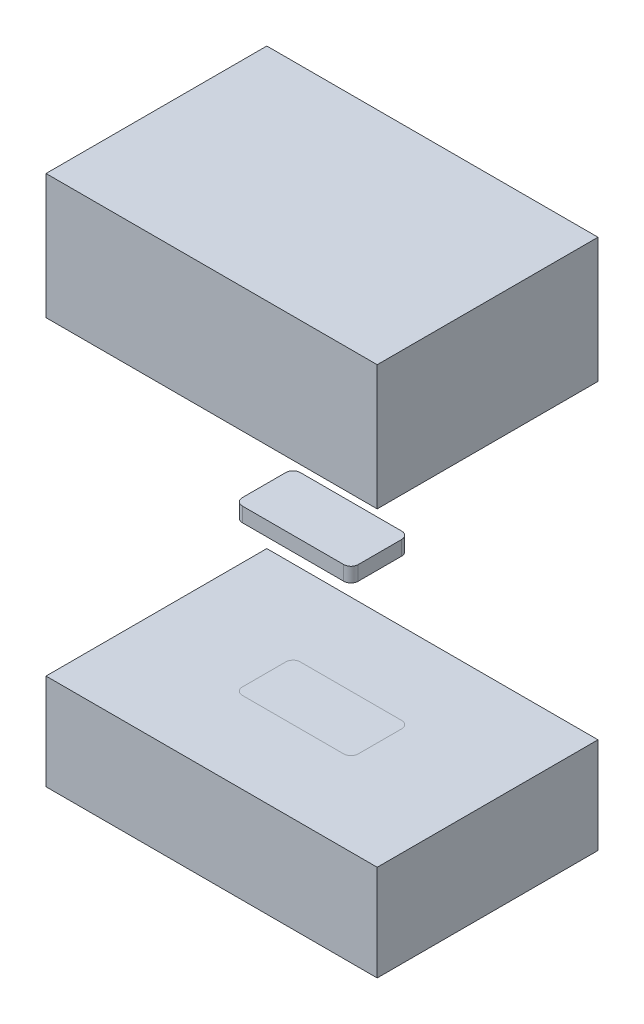
ISO-10303-21;
HEADER;
FILE_DESCRIPTION(('STEP AP214'),'2;1');
FILE_NAME('part.step','',(''),(''),'','','');
FILE_SCHEMA(('AUTOMOTIVE_DESIGN { 1 0 10303 214 1 1 1 1 }'));
ENDSEC;
DATA;
#1=APPLICATION_CONTEXT('core data for automotive mechanical design processes');
#2=APPLICATION_PROTOCOL_DEFINITION('international standard','automotive_design',2000,#1);
#3=PRODUCT_CONTEXT('',#1,'mechanical');
#4=PRODUCT('Part','Part','',(#3));
#5=PRODUCT_RELATED_PRODUCT_CATEGORY('part','',(#4));
#6=PRODUCT_DEFINITION_FORMATION('','',#4);
#7=PRODUCT_DEFINITION_CONTEXT('part definition',#1,'design');
#8=PRODUCT_DEFINITION('design','',#6,#7);
#9=PRODUCT_DEFINITION_SHAPE('','',#8);
#10=(LENGTH_UNIT() NAMED_UNIT(*) SI_UNIT(.MILLI.,.METRE.));
#11=(NAMED_UNIT(*) PLANE_ANGLE_UNIT() SI_UNIT($,.RADIAN.));
#12=(NAMED_UNIT(*) SI_UNIT($,.STERADIAN.) SOLID_ANGLE_UNIT());
#13=UNCERTAINTY_MEASURE_WITH_UNIT(LENGTH_MEASURE(1.E-05),#10,'distance_accuracy_value','');
#14=(GEOMETRIC_REPRESENTATION_CONTEXT(3) GLOBAL_UNCERTAINTY_ASSIGNED_CONTEXT((#13)) GLOBAL_UNIT_ASSIGNED_CONTEXT((#10,
#11,#12)) REPRESENTATION_CONTEXT('',''));
#15=CARTESIAN_POINT('',(0.,0.,0.));
#16=DIRECTION('',(0.,0.,1.));
#17=DIRECTION('',(1.,0.,0.));
#18=AXIS2_PLACEMENT_3D('',#15,#16,#17);
#19=CARTESIAN_POINT('',(0.,-116.265936917931,0.));
#20=DIRECTION('',(0.,-1.,0.));
#21=DIRECTION('',(0.,0.,-1.));
#22=AXIS2_PLACEMENT_3D('',#19,#20,#21);
#23=PLANE('',#22);
#24=DIRECTION('',(0.,0.,-1.));
#25=VECTOR('',#24,1.);
#26=CARTESIAN_POINT('',(76.2,-116.265936917931,50.8));
#27=LINE('',#26,#25);
#28=CARTESIAN_POINT('',(76.2,-116.265936917931,50.8));
#29=VERTEX_POINT('',#28);
#30=CARTESIAN_POINT('',(76.2,-116.265936917931,-50.8));
#31=VERTEX_POINT('',#30);
#32=EDGE_CURVE('E773',#29,#31,#27,.T.);
#33=ORIENTED_EDGE('',*,*,#32,.F.);
#34=DIRECTION('',(1.,0.,0.));
#35=VECTOR('',#34,1.);
#36=CARTESIAN_POINT('',(-76.2,-116.265936917931,50.8));
#37=LINE('',#36,#35);
#38=CARTESIAN_POINT('',(-76.2,-116.265936917931,50.8));
#39=VERTEX_POINT('',#38);
#40=EDGE_CURVE('E782',#39,#29,#37,.T.);
#41=ORIENTED_EDGE('',*,*,#40,.F.);
#42=DIRECTION('',(0.,0.,1.));
#43=VECTOR('',#42,1.);
#44=CARTESIAN_POINT('',(-76.2,-116.265936917931,50.8));
#45=LINE('',#44,#43);
#46=CARTESIAN_POINT('',(-76.2,-116.265936917931,-50.8));
#47=VERTEX_POINT('',#46);
#48=EDGE_CURVE('E779',#47,#39,#45,.T.);
#49=ORIENTED_EDGE('',*,*,#48,.F.);
#50=DIRECTION('',(-1.,0.,0.));
#51=VECTOR('',#50,1.);
#52=CARTESIAN_POINT('',(-76.2,-116.265936917931,-50.8));
#53=LINE('',#52,#51);
#54=EDGE_CURVE('E776',#31,#47,#53,.T.);
#55=ORIENTED_EDGE('',*,*,#54,.F.);
#56=EDGE_LOOP('',(#33,#41,#49,#55));
#57=FACE_BOUND('',#56,.T.);
#58=ADVANCED_FACE('F674',(#57),#23,.T.);
#59=CARTESIAN_POINT('',(-76.2,-116.265936917931,-50.8));
#60=DIRECTION('',(0.,0.,-1.));
#61=DIRECTION('',(-1.,0.,0.));
#62=AXIS2_PLACEMENT_3D('',#59,#60,#61);
#63=PLANE('',#62);
#64=DIRECTION('',(0.,1.,0.));
#65=VECTOR('',#64,1.);
#66=CARTESIAN_POINT('',(-76.2,-116.265936917931,-50.8));
#67=LINE('',#66,#65);
#68=CARTESIAN_POINT('',(-76.2,-72.1334369179305,-50.8));
#69=VERTEX_POINT('',#68);
#70=EDGE_CURVE('E792',#47,#69,#67,.T.);
#71=ORIENTED_EDGE('',*,*,#70,.T.);
#72=DIRECTION('',(1.,0.,0.));
#73=VECTOR('',#72,1.);
#74=CARTESIAN_POINT('',(-76.2,-72.1334369179305,-50.8));
#75=LINE('',#74,#73);
#76=CARTESIAN_POINT('',(76.2,-72.1334369179305,-50.8));
#77=VERTEX_POINT('',#76);
#78=EDGE_CURVE('E678',#69,#77,#75,.T.);
#79=ORIENTED_EDGE('',*,*,#78,.T.);
#80=DIRECTION('',(0.,1.,0.));
#81=VECTOR('',#80,1.);
#82=CARTESIAN_POINT('',(76.2,-116.265936917931,-50.8));
#83=LINE('',#82,#81);
#84=EDGE_CURVE('E785',#31,#77,#83,.T.);
#85=ORIENTED_EDGE('',*,*,#84,.F.);
#86=ORIENTED_EDGE('',*,*,#54,.T.);
#87=EDGE_LOOP('',(#71,#79,#85,#86));
#88=FACE_BOUND('',#87,.T.);
#89=ADVANCED_FACE('F809',(#88),#63,.T.);
#90=CARTESIAN_POINT('',(-76.2,-116.265936917931,50.8));
#91=DIRECTION('',(-1.,0.,0.));
#92=DIRECTION('',(0.,0.,1.));
#93=AXIS2_PLACEMENT_3D('',#90,#91,#92);
#94=PLANE('',#93);
#95=DIRECTION('',(0.,1.,0.));
#96=VECTOR('',#95,1.);
#97=CARTESIAN_POINT('',(-76.2,-116.265936917931,50.8));
#98=LINE('',#97,#96);
#99=CARTESIAN_POINT('',(-76.2,-72.1334369179305,50.8));
#100=VERTEX_POINT('',#99);
#101=EDGE_CURVE('E789',#39,#100,#98,.T.);
#102=ORIENTED_EDGE('',*,*,#101,.T.);
#103=DIRECTION('',(0.,0.,-1.));
#104=VECTOR('',#103,1.);
#105=CARTESIAN_POINT('',(-76.2,-72.1334369179305,50.8));
#106=LINE('',#105,#104);
#107=EDGE_CURVE('E759',#100,#69,#106,.T.);
#108=ORIENTED_EDGE('',*,*,#107,.T.);
#109=ORIENTED_EDGE('',*,*,#70,.F.);
#110=ORIENTED_EDGE('',*,*,#48,.T.);
#111=EDGE_LOOP('',(#102,#108,#109,#110));
#112=FACE_BOUND('',#111,.T.);
#113=ADVANCED_FACE('F816',(#112),#94,.T.);
#114=CARTESIAN_POINT('',(-76.2,-116.265936917931,50.8));
#115=DIRECTION('',(0.,0.,1.));
#116=DIRECTION('',(1.,0.,0.));
#117=AXIS2_PLACEMENT_3D('',#114,#115,#116);
#118=PLANE('',#117);
#119=DIRECTION('',(0.,1.,0.));
#120=VECTOR('',#119,1.);
#121=CARTESIAN_POINT('',(76.2,-116.265936917931,50.8));
#122=LINE('',#121,#120);
#123=CARTESIAN_POINT('',(76.2,-72.1334369179305,50.8));
#124=VERTEX_POINT('',#123);
#125=EDGE_CURVE('E786',#29,#124,#122,.T.);
#126=ORIENTED_EDGE('',*,*,#125,.T.);
#127=DIRECTION('',(-1.,0.,0.));
#128=VECTOR('',#127,1.);
#129=CARTESIAN_POINT('',(-76.2,-72.1334369179305,50.8));
#130=LINE('',#129,#128);
#131=EDGE_CURVE('E767',#124,#100,#130,.T.);
#132=ORIENTED_EDGE('',*,*,#131,.T.);
#133=ORIENTED_EDGE('',*,*,#101,.F.);
#134=ORIENTED_EDGE('',*,*,#40,.T.);
#135=EDGE_LOOP('',(#126,#132,#133,#134));
#136=FACE_BOUND('',#135,.T.);
#137=ADVANCED_FACE('F824',(#136),#118,.T.);
#138=CARTESIAN_POINT('',(76.2,-116.265936917931,50.8));
#139=DIRECTION('',(1.,0.,0.));
#140=DIRECTION('',(0.,0.,-1.));
#141=AXIS2_PLACEMENT_3D('',#138,#139,#140);
#142=PLANE('',#141);
#143=ORIENTED_EDGE('',*,*,#84,.T.);
#144=DIRECTION('',(0.,0.,1.));
#145=VECTOR('',#144,1.);
#146=CARTESIAN_POINT('',(76.2,-72.1334369179305,50.8));
#147=LINE('',#146,#145);
#148=EDGE_CURVE('E770',#77,#124,#147,.T.);
#149=ORIENTED_EDGE('',*,*,#148,.T.);
#150=ORIENTED_EDGE('',*,*,#125,.F.);
#151=ORIENTED_EDGE('',*,*,#32,.T.);
#152=EDGE_LOOP('',(#143,#149,#150,#151));
#153=FACE_BOUND('',#152,.T.);
#154=ADVANCED_FACE('F676',(#153),#142,.T.);
#155=CARTESIAN_POINT('',(0.,-72.1334369179305,0.));
#156=DIRECTION('',(0.,-1.,0.));
#157=DIRECTION('',(0.,0.,-1.));
#158=AXIS2_PLACEMENT_3D('',#155,#156,#157);
#159=PLANE('',#158);
#160=DIRECTION('',(0.,0.,1.));
#161=VECTOR('',#160,1.);
#162=CARTESIAN_POINT('',(-26.67,-72.1334369179305,13.335));
#163=LINE('',#162,#161);
#164=CARTESIAN_POINT('',(-26.67,-72.1334369179305,-10.00125));
#165=VERTEX_POINT('',#164);
#166=CARTESIAN_POINT('',(-26.67,-72.1334369179305,10.00125));
#167=VERTEX_POINT('',#166);
#168=EDGE_CURVE('E694',#165,#167,#163,.T.);
#169=ORIENTED_EDGE('',*,*,#168,.T.);
#170=CARTESIAN_POINT('',(-23.33625,-72.1334369179305,13.335));
#171=CARTESIAN_POINT('',(-23.6643178177945,-72.1334369179305,13.335));
#172=CARTESIAN_POINT('',(-23.9866323610213,-72.1334369179305,13.2709429285443));
#173=CARTESIAN_POINT('',(-24.3081401158317,-72.1334369179305,13.2070461989171));
#174=CARTESIAN_POINT('',(-24.6120208926471,-72.1334369179305,13.0812333915095));
#175=CARTESIAN_POINT('',(-24.9148853325436,-72.1334369179305,12.955841368208));
#176=CARTESIAN_POINT('',(-25.1883822643291,-72.1334369179305,12.7731618200136));
#177=CARTESIAN_POINT('',(-25.4609644787351,-72.1334369179305,12.591093248171));
#178=CARTESIAN_POINT('',(-25.6935672317807,-72.1334369179305,12.3585672317807));
#179=CARTESIAN_POINT('',(-25.9253920390568,-72.1334369179305,12.126818904512));
#180=CARTESIAN_POINT('',(-26.1081618200136,-72.1334369179305,11.8533822643291));
#181=CARTESIAN_POINT('',(-26.2903203228309,-72.1334369179305,11.5808601398818));
#182=CARTESIAN_POINT('',(-26.4162333915095,-72.1334369179305,11.2770208926471));
#183=CARTESIAN_POINT('',(-26.5417253407581,-72.1334369179305,10.9741978434287));
#184=CARTESIAN_POINT('',(-26.6059429285443,-72.1334369179305,10.6516323610213));
#185=CARTESIAN_POINT('',(-26.67,-72.1334369179305,10.3298731534889));
#186=CARTESIAN_POINT('',(-26.67,-72.1334369179305,10.00125));
#187=B_SPLINE_CURVE_WITH_KNOTS('',2,(#170,#171,#172,#173,#174,#175,#176,#177,#178,#179,#180,
#181,#182,#183,#184,#185,#186),.UNSPECIFIED.,.F.,.F.,(3,2,2,2,2,2,2,2,3),(0.,0.125,0.25,0.375,
0.5,0.625,0.75,0.875,1.),.UNSPECIFIED.);
#188=CARTESIAN_POINT('',(-23.33625,-72.1334369179305,13.335));
#189=VERTEX_POINT('',#188);
#190=EDGE_CURVE('E14',#189,#167,#187,.T.);
#191=ORIENTED_EDGE('',*,*,#190,.F.);
#192=DIRECTION('',(1.,0.,0.));
#193=VECTOR('',#192,1.);
#194=CARTESIAN_POINT('',(-26.67,-72.1334369179305,13.335));
#195=LINE('',#194,#193);
#196=CARTESIAN_POINT('',(23.33625,-72.1334369179305,13.335));
#197=VERTEX_POINT('',#196);
#198=EDGE_CURVE('E685',#189,#197,#195,.T.);
#199=ORIENTED_EDGE('',*,*,#198,.T.);
#200=CARTESIAN_POINT('',(26.67,-72.1334369179305,10.00125));
#201=CARTESIAN_POINT('',(26.67,-72.1334369179305,10.3293178177965));
#202=CARTESIAN_POINT('',(26.6059429285443,-72.1334369179305,10.6516323610213));
#203=CARTESIAN_POINT('',(26.5420461989163,-72.1334369179305,10.9731401158338));
#204=CARTESIAN_POINT('',(26.4162333915095,-72.1334369179305,11.2770208926471));
#205=CARTESIAN_POINT('',(26.2908413682076,-72.1334369179305,11.5798853325444));
#206=CARTESIAN_POINT('',(26.1081618200136,-72.1334369179305,11.8533822643291));
#207=CARTESIAN_POINT('',(25.9260932481726,-72.1334369179305,12.1259644787325));
#208=CARTESIAN_POINT('',(25.6935672317807,-72.1334369179305,12.3585672317807));
#209=CARTESIAN_POINT('',(25.4618189045109,-72.1334369179305,12.5903920390589));
#210=CARTESIAN_POINT('',(25.1883822643291,-72.1334369179305,12.7731618200136));
#211=CARTESIAN_POINT('',(24.915860139879,-72.1334369179305,12.9553203228314));
#212=CARTESIAN_POINT('',(24.6120208926471,-72.1334369179305,13.0812333915095));
#213=CARTESIAN_POINT('',(24.3091978434303,-72.1334369179305,13.2067253407581));
#214=CARTESIAN_POINT('',(23.9866323610213,-72.1334369179305,13.2709429285443));
#215=CARTESIAN_POINT('',(23.6648731534873,-72.1334369179305,13.335));
#216=CARTESIAN_POINT('',(23.33625,-72.1334369179305,13.335));
#217=B_SPLINE_CURVE_WITH_KNOTS('',2,(#200,#201,#202,#203,#204,#205,#206,#207,#208,#209,#210,
#211,#212,#213,#214,#215,#216),.UNSPECIFIED.,.F.,.F.,(3,2,2,2,2,2,2,2,3),(0.,0.125,0.25,0.375,
0.5,0.625,0.75,0.875,1.),.UNSPECIFIED.);
#218=CARTESIAN_POINT('',(26.67,-72.1334369179305,10.00125));
#219=VERTEX_POINT('',#218);
#220=EDGE_CURVE('E708',#219,#197,#217,.T.);
#221=ORIENTED_EDGE('',*,*,#220,.F.);
#222=DIRECTION('',(0.,0.,-1.));
#223=VECTOR('',#222,1.);
#224=CARTESIAN_POINT('',(26.67,-72.1334369179305,13.335));
#225=LINE('',#224,#223);
#226=CARTESIAN_POINT('',(26.67,-72.1334369179305,-10.00125));
#227=VERTEX_POINT('',#226);
#228=EDGE_CURVE('E715',#219,#227,#225,.T.);
#229=ORIENTED_EDGE('',*,*,#228,.T.);
#230=CARTESIAN_POINT('',(23.33625,-72.1334369179305,-13.335));
#231=CARTESIAN_POINT('',(23.6643178177965,-72.1334369179305,-13.335));
#232=CARTESIAN_POINT('',(23.9866323610213,-72.1334369179305,-13.2709429285443));
#233=CARTESIAN_POINT('',(24.3081401158328,-72.1334369179305,-13.2070461989165));
#234=CARTESIAN_POINT('',(24.6120208926471,-72.1334369179305,-13.0812333915095));
#235=CARTESIAN_POINT('',(24.9148853325409,-72.1334369179305,-12.9558413682093));
#236=CARTESIAN_POINT('',(25.1883822643291,-72.1334369179305,-12.7731618200136));
#237=CARTESIAN_POINT('',(25.4609644787335,-72.1334369179305,-12.5910932481726));
#238=CARTESIAN_POINT('',(25.6935672317807,-72.1334369179305,-12.3585672317807));
#239=CARTESIAN_POINT('',(25.92539203906,-72.1334369179305,-12.1268189045089));
#240=CARTESIAN_POINT('',(26.1081618200136,-72.1334369179305,-11.8533822643291));
#241=CARTESIAN_POINT('',(26.2903203228321,-72.1334369179305,-11.5808601398784));
#242=CARTESIAN_POINT('',(26.4162333915095,-72.1334369179305,-11.2770208926471));
#243=CARTESIAN_POINT('',(26.5417253407565,-72.1334369179305,-10.9741978434329));
#244=CARTESIAN_POINT('',(26.6059429285443,-72.1334369179305,-10.6516323610213));
#245=CARTESIAN_POINT('',(26.67,-72.1334369179305,-10.3298731534925));
#246=CARTESIAN_POINT('',(26.67,-72.1334369179305,-10.00125));
#247=B_SPLINE_CURVE_WITH_KNOTS('',2,(#230,#231,#232,#233,#234,#235,#236,#237,#238,#239,#240,
#241,#242,#243,#244,#245,#246),.UNSPECIFIED.,.F.,.F.,(3,2,2,2,2,2,2,2,3),(0.,0.125,0.25,0.375,
0.5,0.625,0.75,0.875,1.),.UNSPECIFIED.);
#248=CARTESIAN_POINT('',(23.33625,-72.1334369179305,-13.335));
#249=VERTEX_POINT('',#248);
#250=EDGE_CURVE('E723',#249,#227,#247,.T.);
#251=ORIENTED_EDGE('',*,*,#250,.F.);
#252=DIRECTION('',(-1.,0.,0.));
#253=VECTOR('',#252,1.);
#254=CARTESIAN_POINT('',(-26.67,-72.1334369179305,-13.335));
#255=LINE('',#254,#253);
#256=CARTESIAN_POINT('',(-23.33625,-72.1334369179305,-13.335));
#257=VERTEX_POINT('',#256);
#258=EDGE_CURVE('E746',#249,#257,#255,.T.);
#259=ORIENTED_EDGE('',*,*,#258,.T.);
#260=CARTESIAN_POINT('',(-26.67,-72.1334369179305,-10.00125));
#261=CARTESIAN_POINT('',(-26.67,-72.1334369179305,-10.3293178177939));
#262=CARTESIAN_POINT('',(-26.6059429285443,-72.1334369179305,-10.6516323610213));
#263=CARTESIAN_POINT('',(-26.5420461989175,-72.1334369179305,-10.9731401158305));
#264=CARTESIAN_POINT('',(-26.4162333915095,-72.1334369179305,-11.2770208926471));
#265=CARTESIAN_POINT('',(-26.2908413682087,-72.1334369179305,-11.5798853325424));
#266=CARTESIAN_POINT('',(-26.1081618200136,-72.1334369179305,-11.8533822643291));
#267=CARTESIAN_POINT('',(-25.9260932481715,-72.1334369179305,-12.1259644787346));
#268=CARTESIAN_POINT('',(-25.6935672317807,-72.1334369179305,-12.3585672317807));
#269=CARTESIAN_POINT('',(-25.4618189045089,-72.1334369179305,-12.5903920390599));
#270=CARTESIAN_POINT('',(-25.1883822643291,-72.1334369179305,-12.7731618200136));
#271=CARTESIAN_POINT('',(-24.9158601398827,-72.1334369179305,-12.9553203228293));
#272=CARTESIAN_POINT('',(-24.6120208926471,-72.1334369179305,-13.0812333915095));
#273=CARTESIAN_POINT('',(-24.3091978434355,-72.1334369179305,-13.2067253407565));
#274=CARTESIAN_POINT('',(-23.9866323610213,-72.1334369179305,-13.2709429285443));
#275=CARTESIAN_POINT('',(-23.6648731534899,-72.1334369179305,-13.335));
#276=CARTESIAN_POINT('',(-23.33625,-72.1334369179305,-13.335));
#277=B_SPLINE_CURVE_WITH_KNOTS('',2,(#260,#261,#262,#263,#264,#265,#266,#267,#268,#269,#270,
#271,#272,#273,#274,#275,#276),.UNSPECIFIED.,.F.,.F.,(3,2,2,2,2,2,2,2,3),(0.,0.125,0.25,0.375,
0.5,0.625,0.75,0.875,1.),.UNSPECIFIED.);
#278=EDGE_CURVE('E754',#165,#257,#277,.T.);
#279=ORIENTED_EDGE('',*,*,#278,.F.);
#280=EDGE_LOOP('',(#169,#191,#199,#221,#229,#251,#259,#279));
#281=FACE_BOUND('',#280,.T.);
#282=ADVANCED_FACE('F706',(#281),#159,.F.);
#283=CARTESIAN_POINT('',(23.33625,-72.1334369179305,-13.335));
#284=DIRECTION('',(0.,1.,0.));
#285=DIRECTION('',(0.707106781186548,0.,0.707106781186547));
#286=AXIS2_PLACEMENT_3D('',#283,#284,#285);
#287=PLANE('',#286);
#288=ORIENTED_EDGE('',*,*,#78,.F.);
#289=ORIENTED_EDGE('',*,*,#107,.F.);
#290=ORIENTED_EDGE('',*,*,#131,.F.);
#291=ORIENTED_EDGE('',*,*,#148,.F.);
#292=EDGE_LOOP('',(#288,#289,#290,#291));
#293=FACE_BOUND('',#292,.T.);
#294=ORIENTED_EDGE('',*,*,#250,.T.);
#295=ORIENTED_EDGE('',*,*,#228,.F.);
#296=ORIENTED_EDGE('',*,*,#220,.T.);
#297=ORIENTED_EDGE('',*,*,#198,.F.);
#298=ORIENTED_EDGE('',*,*,#190,.T.);
#299=ORIENTED_EDGE('',*,*,#168,.F.);
#300=ORIENTED_EDGE('',*,*,#278,.T.);
#301=ORIENTED_EDGE('',*,*,#258,.F.);
#302=EDGE_LOOP('',(#294,#295,#296,#297,#298,#299,#300,#301));
#303=FACE_BOUND('',#302,.T.);
#304=ADVANCED_FACE('F714',(#293,#303),#287,.T.);
#305=CLOSED_SHELL('',(#58,#89,#113,#137,#154,#282,#304));
#306=MANIFOLD_SOLID_BREP('B2',#305);
#307=CARTESIAN_POINT('',(76.2,26.5379321525398,50.8));
#308=DIRECTION('',(1.,0.,0.));
#309=DIRECTION('',(0.,0.,-1.));
#310=AXIS2_PLACEMENT_3D('',#307,#308,#309);
#311=PLANE('',#310);
#312=DIRECTION('',(0.,0.,1.));
#313=VECTOR('',#312,1.);
#314=CARTESIAN_POINT('',(76.2,70.6704321525398,50.8));
#315=LINE('',#314,#313);
#316=CARTESIAN_POINT('',(76.2,70.6704321525398,-50.8));
#317=VERTEX_POINT('',#316);
#318=CARTESIAN_POINT('',(76.2,70.6704321525398,50.8));
#319=VERTEX_POINT('',#318);
#320=EDGE_CURVE('E1086',#317,#319,#315,.T.);
#321=ORIENTED_EDGE('',*,*,#320,.F.);
#322=DIRECTION('',(0.,1.,0.));
#323=VECTOR('',#322,1.);
#324=CARTESIAN_POINT('',(76.2,26.5379321525398,-50.8));
#325=LINE('',#324,#323);
#326=CARTESIAN_POINT('',(76.2,128.13793215254,-50.8));
#327=VERTEX_POINT('',#326);
#328=EDGE_CURVE('E1080',#317,#327,#325,.T.);
#329=ORIENTED_EDGE('',*,*,#328,.T.);
#330=DIRECTION('',(0.,0.,-1.));
#331=VECTOR('',#330,1.);
#332=CARTESIAN_POINT('',(76.2,128.13793215254,50.8));
#333=LINE('',#332,#331);
#334=CARTESIAN_POINT('',(76.2,128.13793215254,50.8));
#335=VERTEX_POINT('',#334);
#336=EDGE_CURVE('E1084',#335,#327,#333,.T.);
#337=ORIENTED_EDGE('',*,*,#336,.F.);
#338=DIRECTION('',(0.,1.,0.));
#339=VECTOR('',#338,1.);
#340=CARTESIAN_POINT('',(76.2,26.5379321525398,50.8));
#341=LINE('',#340,#339);
#342=EDGE_CURVE('E1108',#319,#335,#341,.T.);
#343=ORIENTED_EDGE('',*,*,#342,.F.);
#344=EDGE_LOOP('',(#321,#329,#337,#343));
#345=FACE_BOUND('',#344,.T.);
#346=ADVANCED_FACE('F986',(#345),#311,.T.);
#347=CARTESIAN_POINT('',(-76.2,26.5379321525398,50.8));
#348=DIRECTION('',(0.,0.,1.));
#349=DIRECTION('',(1.,0.,0.));
#350=AXIS2_PLACEMENT_3D('',#347,#348,#349);
#351=PLANE('',#350);
#352=DIRECTION('',(-1.,0.,0.));
#353=VECTOR('',#352,1.);
#354=CARTESIAN_POINT('',(-76.2,70.6704321525398,50.8));
#355=LINE('',#354,#353);
#356=CARTESIAN_POINT('',(-76.2,70.6704321525398,50.8));
#357=VERTEX_POINT('',#356);
#358=EDGE_CURVE('E1059',#319,#357,#355,.T.);
#359=ORIENTED_EDGE('',*,*,#358,.F.);
#360=ORIENTED_EDGE('',*,*,#342,.T.);
#361=DIRECTION('',(1.,0.,0.));
#362=VECTOR('',#361,1.);
#363=CARTESIAN_POINT('',(-76.2,128.13793215254,50.8));
#364=LINE('',#363,#362);
#365=CARTESIAN_POINT('',(-76.2,128.13793215254,50.8));
#366=VERTEX_POINT('',#365);
#367=EDGE_CURVE('E1090',#366,#335,#364,.T.);
#368=ORIENTED_EDGE('',*,*,#367,.F.);
#369=DIRECTION('',(0.,1.,0.));
#370=VECTOR('',#369,1.);
#371=CARTESIAN_POINT('',(-76.2,26.5379321525398,50.8));
#372=LINE('',#371,#370);
#373=EDGE_CURVE('E1111',#357,#366,#372,.T.);
#374=ORIENTED_EDGE('',*,*,#373,.F.);
#375=EDGE_LOOP('',(#359,#360,#368,#374));
#376=FACE_BOUND('',#375,.T.);
#377=ADVANCED_FACE('F1117',(#376),#351,.T.);
#378=CARTESIAN_POINT('',(-76.2,26.5379321525398,50.8));
#379=DIRECTION('',(-1.,0.,0.));
#380=DIRECTION('',(0.,0.,1.));
#381=AXIS2_PLACEMENT_3D('',#378,#379,#380);
#382=PLANE('',#381);
#383=DIRECTION('',(0.,0.,-1.));
#384=VECTOR('',#383,1.);
#385=CARTESIAN_POINT('',(-76.2,70.6704321525398,50.8));
#386=LINE('',#385,#384);
#387=CARTESIAN_POINT('',(-76.2,70.6704321525398,-50.8));
#388=VERTEX_POINT('',#387);
#389=EDGE_CURVE('E1110',#357,#388,#386,.T.);
#390=ORIENTED_EDGE('',*,*,#389,.F.);
#391=ORIENTED_EDGE('',*,*,#373,.T.);
#392=DIRECTION('',(0.,0.,1.));
#393=VECTOR('',#392,1.);
#394=CARTESIAN_POINT('',(-76.2,128.13793215254,50.8));
#395=LINE('',#394,#393);
#396=CARTESIAN_POINT('',(-76.2,128.13793215254,-50.8));
#397=VERTEX_POINT('',#396);
#398=EDGE_CURVE('E1098',#397,#366,#395,.T.);
#399=ORIENTED_EDGE('',*,*,#398,.F.);
#400=DIRECTION('',(0.,1.,0.));
#401=VECTOR('',#400,1.);
#402=CARTESIAN_POINT('',(-76.2,26.5379321525398,-50.8));
#403=LINE('',#402,#401);
#404=EDGE_CURVE('E1089',#388,#397,#403,.T.);
#405=ORIENTED_EDGE('',*,*,#404,.F.);
#406=EDGE_LOOP('',(#390,#391,#399,#405));
#407=FACE_BOUND('',#406,.T.);
#408=ADVANCED_FACE('F1115',(#407),#382,.T.);
#409=CARTESIAN_POINT('',(-76.2,26.5379321525398,-50.8));
#410=DIRECTION('',(0.,0.,-1.));
#411=DIRECTION('',(-1.,0.,0.));
#412=AXIS2_PLACEMENT_3D('',#409,#410,#411);
#413=PLANE('',#412);
#414=DIRECTION('',(1.,0.,0.));
#415=VECTOR('',#414,1.);
#416=CARTESIAN_POINT('',(-76.2,70.6704321525398,-50.8));
#417=LINE('',#416,#415);
#418=EDGE_CURVE('E989',#388,#317,#417,.T.);
#419=ORIENTED_EDGE('',*,*,#418,.F.);
#420=ORIENTED_EDGE('',*,*,#404,.T.);
#421=DIRECTION('',(-1.,0.,0.));
#422=VECTOR('',#421,1.);
#423=CARTESIAN_POINT('',(-76.2,128.13793215254,-50.8));
#424=LINE('',#423,#422);
#425=EDGE_CURVE('E1092',#327,#397,#424,.T.);
#426=ORIENTED_EDGE('',*,*,#425,.F.);
#427=ORIENTED_EDGE('',*,*,#328,.F.);
#428=EDGE_LOOP('',(#419,#420,#426,#427));
#429=FACE_BOUND('',#428,.T.);
#430=ADVANCED_FACE('F1093',(#429),#413,.T.);
#431=CARTESIAN_POINT('',(0.,128.13793215254,0.));
#432=DIRECTION('',(0.,-1.,0.));
#433=DIRECTION('',(0.,0.,-1.));
#434=AXIS2_PLACEMENT_3D('',#431,#432,#433);
#435=PLANE('',#434);
#436=ORIENTED_EDGE('',*,*,#336,.T.);
#437=ORIENTED_EDGE('',*,*,#425,.T.);
#438=ORIENTED_EDGE('',*,*,#398,.T.);
#439=ORIENTED_EDGE('',*,*,#367,.T.);
#440=EDGE_LOOP('',(#436,#437,#438,#439));
#441=FACE_BOUND('',#440,.T.);
#442=ADVANCED_FACE('F1100',(#441),#435,.F.);
#443=CARTESIAN_POINT('',(-26.67,77.3379321525398,13.335));
#444=DIRECTION('',(1.,0.,0.));
#445=DIRECTION('',(0.,0.,-1.));
#446=AXIS2_PLACEMENT_3D('',#443,#444,#445);
#447=PLANE('',#446);
#448=DIRECTION('',(0.,0.,1.));
#449=VECTOR('',#448,1.);
#450=CARTESIAN_POINT('',(-26.67,77.3379321525398,13.335));
#451=LINE('',#450,#449);
#452=CARTESIAN_POINT('',(-26.67,77.3379321525398,-10.00125));
#453=VERTEX_POINT('',#452);
#454=CARTESIAN_POINT('',(-26.67,77.3379321525398,10.00125));
#455=VERTEX_POINT('',#454);
#456=EDGE_CURVE('E1138',#453,#455,#451,.T.);
#457=ORIENTED_EDGE('',*,*,#456,.T.);
#458=DIRECTION('',(0.,-1.,0.));
#459=VECTOR('',#458,1.);
#460=CARTESIAN_POINT('',(-26.67,77.3379321525398,10.00125));
#461=LINE('',#460,#459);
#462=CARTESIAN_POINT('',(-26.67,70.6704321525398,10.00125));
#463=VERTEX_POINT('',#462);
#464=EDGE_CURVE('E1166',#463,#455,#461,.F.);
#465=ORIENTED_EDGE('',*,*,#464,.F.);
#466=DIRECTION('',(0.,0.,1.));
#467=VECTOR('',#466,1.);
#468=CARTESIAN_POINT('',(-26.67,70.6704321525398,13.335));
#469=LINE('',#468,#467);
#470=CARTESIAN_POINT('',(-26.67,70.6704321525398,-10.00125));
#471=VERTEX_POINT('',#470);
#472=EDGE_CURVE('E1137',#471,#463,#469,.T.);
#473=ORIENTED_EDGE('',*,*,#472,.F.);
#474=DIRECTION('',(0.,-1.,0.));
#475=VECTOR('',#474,1.);
#476=CARTESIAN_POINT('',(-26.67,77.3379321525398,-10.00125));
#477=LINE('',#476,#475);
#478=EDGE_CURVE('E1135',#453,#471,#477,.T.);
#479=ORIENTED_EDGE('',*,*,#478,.F.);
#480=EDGE_LOOP('',(#457,#465,#473,#479));
#481=FACE_BOUND('',#480,.T.);
#482=ADVANCED_FACE('F1213',(#481),#447,.T.);
#483=CARTESIAN_POINT('',(-23.33625,77.3379321525398,10.00125));
#484=DIRECTION('',(0.,-1.,0.));
#485=DIRECTION('',(0.,0.,-1.));
#486=AXIS2_PLACEMENT_3D('',#483,#484,#485);
#487=CYLINDRICAL_SURFACE('',#486,3.33375);
#488=CARTESIAN_POINT('',(-23.33625,77.3379321525398,10.00125));
#489=DIRECTION('',(0.,-1.,0.));
#490=DIRECTION('',(0.,0.,-1.));
#491=AXIS2_PLACEMENT_3D('',#488,#489,#490);
#492=CIRCLE('',#491,3.33375);
#493=CARTESIAN_POINT('',(-23.33625,77.3379321525398,13.335));
#494=VERTEX_POINT('',#493);
#495=EDGE_CURVE('E1134',#455,#494,#492,.F.);
#496=ORIENTED_EDGE('',*,*,#495,.T.);
#497=DIRECTION('',(0.,-1.,0.));
#498=VECTOR('',#497,1.);
#499=CARTESIAN_POINT('',(-23.33625,77.3379321525398,13.335));
#500=LINE('',#499,#498);
#501=CARTESIAN_POINT('',(-23.33625,70.6704321525398,13.335));
#502=VERTEX_POINT('',#501);
#503=EDGE_CURVE('E1133',#494,#502,#500,.T.);
#504=ORIENTED_EDGE('',*,*,#503,.T.);
#505=CARTESIAN_POINT('',(-23.33625,70.6704321525398,10.00125));
#506=DIRECTION('',(0.,-1.,0.));
#507=DIRECTION('',(0.,0.,-1.));
#508=AXIS2_PLACEMENT_3D('',#505,#506,#507);
#509=CIRCLE('',#508,3.33375);
#510=EDGE_CURVE('E1130',#502,#463,#509,.T.);
#511=ORIENTED_EDGE('',*,*,#510,.T.);
#512=ORIENTED_EDGE('',*,*,#464,.T.);
#513=EDGE_LOOP('',(#496,#504,#511,#512));
#514=FACE_BOUND('',#513,.T.);
#515=ADVANCED_FACE('F1211',(#514),#487,.F.);
#516=CARTESIAN_POINT('',(-26.67,77.3379321525398,13.335));
#517=DIRECTION('',(0.,0.,-1.));
#518=DIRECTION('',(-1.,0.,0.));
#519=AXIS2_PLACEMENT_3D('',#516,#517,#518);
#520=PLANE('',#519);
#521=DIRECTION('',(1.,0.,0.));
#522=VECTOR('',#521,1.);
#523=CARTESIAN_POINT('',(-26.67,70.6704321525398,13.335));
#524=LINE('',#523,#522);
#525=CARTESIAN_POINT('',(23.33625,70.6704321525398,13.335));
#526=VERTEX_POINT('',#525);
#527=EDGE_CURVE('E1162',#502,#526,#524,.T.);
#528=ORIENTED_EDGE('',*,*,#527,.F.);
#529=ORIENTED_EDGE('',*,*,#503,.F.);
#530=DIRECTION('',(1.,0.,0.));
#531=VECTOR('',#530,1.);
#532=CARTESIAN_POINT('',(-26.67,77.3379321525398,13.335));
#533=LINE('',#532,#531);
#534=CARTESIAN_POINT('',(23.33625,77.3379321525398,13.335));
#535=VERTEX_POINT('',#534);
#536=EDGE_CURVE('E1161',#494,#535,#533,.T.);
#537=ORIENTED_EDGE('',*,*,#536,.T.);
#538=DIRECTION('',(0.,-1.,0.));
#539=VECTOR('',#538,1.);
#540=CARTESIAN_POINT('',(23.33625,77.3379321525398,13.335));
#541=LINE('',#540,#539);
#542=EDGE_CURVE('E1158',#526,#535,#541,.F.);
#543=ORIENTED_EDGE('',*,*,#542,.F.);
#544=EDGE_LOOP('',(#528,#529,#537,#543));
#545=FACE_BOUND('',#544,.T.);
#546=ADVANCED_FACE('F1204',(#545),#520,.T.);
#547=CARTESIAN_POINT('',(23.33625,77.3379321525398,10.00125));
#548=DIRECTION('',(0.,-1.,0.));
#549=DIRECTION('',(0.,0.,-1.));
#550=AXIS2_PLACEMENT_3D('',#547,#548,#549);
#551=CYLINDRICAL_SURFACE('',#550,3.33375);
#552=CARTESIAN_POINT('',(23.33625,77.3379321525398,10.00125));
#553=DIRECTION('',(0.,-1.,0.));
#554=DIRECTION('',(0.,0.,-1.));
#555=AXIS2_PLACEMENT_3D('',#552,#553,#554);
#556=CIRCLE('',#555,3.33375);
#557=CARTESIAN_POINT('',(26.67,77.3379321525398,10.00125));
#558=VERTEX_POINT('',#557);
#559=EDGE_CURVE('E1129',#535,#558,#556,.F.);
#560=ORIENTED_EDGE('',*,*,#559,.T.);
#561=DIRECTION('',(0.,-1.,0.));
#562=VECTOR('',#561,1.);
#563=CARTESIAN_POINT('',(26.67,77.3379321525398,10.00125));
#564=LINE('',#563,#562);
#565=CARTESIAN_POINT('',(26.67,70.6704321525398,10.00125));
#566=VERTEX_POINT('',#565);
#567=EDGE_CURVE('E1128',#558,#566,#564,.T.);
#568=ORIENTED_EDGE('',*,*,#567,.T.);
#569=CARTESIAN_POINT('',(23.33625,70.6704321525398,10.00125));
#570=DIRECTION('',(0.,-1.,0.));
#571=DIRECTION('',(0.,0.,-1.));
#572=AXIS2_PLACEMENT_3D('',#569,#570,#571);
#573=CIRCLE('',#572,3.33375);
#574=EDGE_CURVE('E1125',#566,#526,#573,.T.);
#575=ORIENTED_EDGE('',*,*,#574,.T.);
#576=ORIENTED_EDGE('',*,*,#542,.T.);
#577=EDGE_LOOP('',(#560,#568,#575,#576));
#578=FACE_BOUND('',#577,.T.);
#579=ADVANCED_FACE('F1202',(#578),#551,.F.);
#580=CARTESIAN_POINT('',(26.67,77.3379321525398,13.335));
#581=DIRECTION('',(-1.,0.,0.));
#582=DIRECTION('',(0.,0.,1.));
#583=AXIS2_PLACEMENT_3D('',#580,#581,#582);
#584=PLANE('',#583);
#585=DIRECTION('',(0.,0.,-1.));
#586=VECTOR('',#585,1.);
#587=CARTESIAN_POINT('',(26.67,70.6704321525398,13.335));
#588=LINE('',#587,#586);
#589=CARTESIAN_POINT('',(26.67,70.6704321525398,-10.00125));
#590=VERTEX_POINT('',#589);
#591=EDGE_CURVE('E1152',#566,#590,#588,.T.);
#592=ORIENTED_EDGE('',*,*,#591,.F.);
#593=ORIENTED_EDGE('',*,*,#567,.F.);
#594=DIRECTION('',(0.,0.,-1.));
#595=VECTOR('',#594,1.);
#596=CARTESIAN_POINT('',(26.67,77.3379321525398,13.335));
#597=LINE('',#596,#595);
#598=CARTESIAN_POINT('',(26.67,77.3379321525398,-10.00125));
#599=VERTEX_POINT('',#598);
#600=EDGE_CURVE('E1151',#558,#599,#597,.T.);
#601=ORIENTED_EDGE('',*,*,#600,.T.);
#602=DIRECTION('',(0.,-1.,0.));
#603=VECTOR('',#602,1.);
#604=CARTESIAN_POINT('',(26.67,77.3379321525398,-10.00125));
#605=LINE('',#604,#603);
#606=EDGE_CURVE('E1148',#590,#599,#605,.F.);
#607=ORIENTED_EDGE('',*,*,#606,.F.);
#608=EDGE_LOOP('',(#592,#593,#601,#607));
#609=FACE_BOUND('',#608,.T.);
#610=ADVANCED_FACE('F1194',(#609),#584,.T.);
#611=CARTESIAN_POINT('',(23.33625,77.3379321525398,-10.00125));
#612=DIRECTION('',(0.,-1.,0.));
#613=DIRECTION('',(0.,0.,-1.));
#614=AXIS2_PLACEMENT_3D('',#611,#612,#613);
#615=CYLINDRICAL_SURFACE('',#614,3.33375);
#616=CARTESIAN_POINT('',(23.33625,77.3379321525398,-10.00125));
#617=DIRECTION('',(0.,-1.,0.));
#618=DIRECTION('',(0.,0.,-1.));
#619=AXIS2_PLACEMENT_3D('',#616,#617,#618);
#620=CIRCLE('',#619,3.33375);
#621=CARTESIAN_POINT('',(23.33625,77.3379321525398,-13.335));
#622=VERTEX_POINT('',#621);
#623=EDGE_CURVE('E1124',#599,#622,#620,.F.);
#624=ORIENTED_EDGE('',*,*,#623,.T.);
#625=DIRECTION('',(0.,-1.,0.));
#626=VECTOR('',#625,1.);
#627=CARTESIAN_POINT('',(23.33625,77.3379321525398,-13.335));
#628=LINE('',#627,#626);
#629=CARTESIAN_POINT('',(23.33625,70.6704321525398,-13.335));
#630=VERTEX_POINT('',#629);
#631=EDGE_CURVE('E1123',#622,#630,#628,.T.);
#632=ORIENTED_EDGE('',*,*,#631,.T.);
#633=CARTESIAN_POINT('',(23.33625,70.6704321525398,-10.00125));
#634=DIRECTION('',(0.,-1.,0.));
#635=DIRECTION('',(0.,0.,-1.));
#636=AXIS2_PLACEMENT_3D('',#633,#634,#635);
#637=CIRCLE('',#636,3.33375);
#638=EDGE_CURVE('E1120',#630,#590,#637,.T.);
#639=ORIENTED_EDGE('',*,*,#638,.T.);
#640=ORIENTED_EDGE('',*,*,#606,.T.);
#641=EDGE_LOOP('',(#624,#632,#639,#640));
#642=FACE_BOUND('',#641,.T.);
#643=ADVANCED_FACE('F1190',(#642),#615,.F.);
#644=CARTESIAN_POINT('',(-26.67,77.3379321525398,-13.335));
#645=DIRECTION('',(0.,0.,1.));
#646=DIRECTION('',(1.,0.,0.));
#647=AXIS2_PLACEMENT_3D('',#644,#645,#646);
#648=PLANE('',#647);
#649=DIRECTION('',(-1.,0.,0.));
#650=VECTOR('',#649,1.);
#651=CARTESIAN_POINT('',(-26.67,70.6704321525398,-13.335));
#652=LINE('',#651,#650);
#653=CARTESIAN_POINT('',(-23.33625,70.6704321525398,-13.335));
#654=VERTEX_POINT('',#653);
#655=EDGE_CURVE('E1142',#630,#654,#652,.T.);
#656=ORIENTED_EDGE('',*,*,#655,.F.);
#657=ORIENTED_EDGE('',*,*,#631,.F.);
#658=DIRECTION('',(-1.,0.,0.));
#659=VECTOR('',#658,1.);
#660=CARTESIAN_POINT('',(-26.67,77.3379321525398,-13.335));
#661=LINE('',#660,#659);
#662=CARTESIAN_POINT('',(-23.33625,77.3379321525398,-13.335));
#663=VERTEX_POINT('',#662);
#664=EDGE_CURVE('E1141',#622,#663,#661,.T.);
#665=ORIENTED_EDGE('',*,*,#664,.T.);
#666=DIRECTION('',(0.,-1.,0.));
#667=VECTOR('',#666,1.);
#668=CARTESIAN_POINT('',(-23.33625,77.3379321525398,-13.335));
#669=LINE('',#668,#667);
#670=EDGE_CURVE('E1139',#654,#663,#669,.F.);
#671=ORIENTED_EDGE('',*,*,#670,.F.);
#672=EDGE_LOOP('',(#656,#657,#665,#671));
#673=FACE_BOUND('',#672,.T.);
#674=ADVANCED_FACE('F1185',(#673),#648,.T.);
#675=CARTESIAN_POINT('',(0.,77.3379321525398,0.));
#676=DIRECTION('',(0.,-1.,0.));
#677=DIRECTION('',(0.,0.,-1.));
#678=AXIS2_PLACEMENT_3D('',#675,#676,#677);
#679=PLANE('',#678);
#680=ORIENTED_EDGE('',*,*,#664,.F.);
#681=ORIENTED_EDGE('',*,*,#623,.F.);
#682=ORIENTED_EDGE('',*,*,#600,.F.);
#683=ORIENTED_EDGE('',*,*,#559,.F.);
#684=ORIENTED_EDGE('',*,*,#536,.F.);
#685=ORIENTED_EDGE('',*,*,#495,.F.);
#686=ORIENTED_EDGE('',*,*,#456,.F.);
#687=CARTESIAN_POINT('',(-23.33625,77.3379321525398,-10.00125));
#688=DIRECTION('',(0.,-1.,0.));
#689=DIRECTION('',(0.,0.,-1.));
#690=AXIS2_PLACEMENT_3D('',#687,#688,#689);
#691=CIRCLE('',#690,3.33375);
#692=EDGE_CURVE('E995',#663,#453,#691,.F.);
#693=ORIENTED_EDGE('',*,*,#692,.F.);
#694=EDGE_LOOP('',(#680,#681,#682,#683,#684,#685,#686,#693));
#695=FACE_BOUND('',#694,.T.);
#696=ADVANCED_FACE('F1187',(#695),#679,.T.);
#697=CARTESIAN_POINT('',(-23.33625,77.3379321525398,-10.00125));
#698=DIRECTION('',(0.,-1.,0.));
#699=DIRECTION('',(0.,0.,-1.));
#700=AXIS2_PLACEMENT_3D('',#697,#698,#699);
#701=CYLINDRICAL_SURFACE('',#700,3.33375);
#702=ORIENTED_EDGE('',*,*,#692,.T.);
#703=ORIENTED_EDGE('',*,*,#478,.T.);
#704=CARTESIAN_POINT('',(-23.33625,70.6704321525398,-10.00125));
#705=DIRECTION('',(0.,-1.,0.));
#706=DIRECTION('',(0.,0.,-1.));
#707=AXIS2_PLACEMENT_3D('',#704,#705,#706);
#708=CIRCLE('',#707,3.33375);
#709=EDGE_CURVE('E672',#471,#654,#708,.T.);
#710=ORIENTED_EDGE('',*,*,#709,.T.);
#711=ORIENTED_EDGE('',*,*,#670,.T.);
#712=EDGE_LOOP('',(#702,#703,#710,#711));
#713=FACE_BOUND('',#712,.T.);
#714=ADVANCED_FACE('F1214',(#713),#701,.F.);
#715=CARTESIAN_POINT('',(23.33625,70.6704321525398,-13.335));
#716=DIRECTION('',(0.,1.,0.));
#717=DIRECTION('',(0.707106781186548,0.,0.707106781186547));
#718=AXIS2_PLACEMENT_3D('',#715,#716,#717);
#719=PLANE('',#718);
#720=ORIENTED_EDGE('',*,*,#320,.T.);
#721=ORIENTED_EDGE('',*,*,#358,.T.);
#722=ORIENTED_EDGE('',*,*,#389,.T.);
#723=ORIENTED_EDGE('',*,*,#418,.T.);
#724=EDGE_LOOP('',(#720,#721,#722,#723));
#725=FACE_BOUND('',#724,.T.);
#726=ORIENTED_EDGE('',*,*,#638,.F.);
#727=ORIENTED_EDGE('',*,*,#655,.T.);
#728=ORIENTED_EDGE('',*,*,#709,.F.);
#729=ORIENTED_EDGE('',*,*,#472,.T.);
#730=ORIENTED_EDGE('',*,*,#510,.F.);
#731=ORIENTED_EDGE('',*,*,#527,.T.);
#732=ORIENTED_EDGE('',*,*,#574,.F.);
#733=ORIENTED_EDGE('',*,*,#591,.T.);
#734=EDGE_LOOP('',(#726,#727,#728,#729,#730,#731,#732,#733));
#735=FACE_BOUND('',#734,.T.);
#736=ADVANCED_FACE('F1198',(#725,#735),#719,.F.);
#737=CLOSED_SHELL('',(#346,#377,#408,#430,#442,#482,#515,#546,#579,#610,#643,#674,#696,#714,#736));
#738=MANIFOLD_SOLID_BREP('B8',#737);
#739=CARTESIAN_POINT('',(26.67,3.33375,13.335));
#740=DIRECTION('',(-1.,0.,0.));
#741=DIRECTION('',(0.,0.,1.));
#742=AXIS2_PLACEMENT_3D('',#739,#740,#741);
#743=PLANE('',#742);
#744=DIRECTION('',(0.,0.,-1.));
#745=VECTOR('',#744,1.);
#746=CARTESIAN_POINT('',(26.67,-3.33375,13.335));
#747=LINE('',#746,#745);
#748=CARTESIAN_POINT('',(26.67,-3.33375,10.00125));
#749=VERTEX_POINT('',#748);
#750=CARTESIAN_POINT('',(26.67,-3.33375,-10.00125));
#751=VERTEX_POINT('',#750);
#752=EDGE_CURVE('E2165',#749,#751,#747,.T.);
#753=ORIENTED_EDGE('',*,*,#752,.T.);
#754=DIRECTION('',(0.,-1.,0.));
#755=VECTOR('',#754,1.);
#756=CARTESIAN_POINT('',(26.67,3.33375,-10.00125));
#757=LINE('',#756,#755);
#758=CARTESIAN_POINT('',(26.67,3.33375,-10.00125));
#759=VERTEX_POINT('',#758);
#760=EDGE_CURVE('E2190',#751,#759,#757,.F.);
#761=ORIENTED_EDGE('',*,*,#760,.T.);
#762=DIRECTION('',(0.,0.,-1.));
#763=VECTOR('',#762,1.);
#764=CARTESIAN_POINT('',(26.67,3.33375,13.335));
#765=LINE('',#764,#763);
#766=CARTESIAN_POINT('',(26.67,3.33375,10.00125));
#767=VERTEX_POINT('',#766);
#768=EDGE_CURVE('E2162',#767,#759,#765,.T.);
#769=ORIENTED_EDGE('',*,*,#768,.F.);
#770=DIRECTION('',(0.,-1.,0.));
#771=VECTOR('',#770,1.);
#772=CARTESIAN_POINT('',(26.67,3.33375,10.00125));
#773=LINE('',#772,#771);
#774=EDGE_CURVE('E2187',#767,#749,#773,.T.);
#775=ORIENTED_EDGE('',*,*,#774,.T.);
#776=EDGE_LOOP('',(#753,#761,#769,#775));
#777=FACE_BOUND('',#776,.T.);
#778=ADVANCED_FACE('F2063',(#777),#743,.F.);
#779=CARTESIAN_POINT('',(-26.67,3.33375,-13.335));
#780=DIRECTION('',(0.,0.,1.));
#781=DIRECTION('',(1.,0.,0.));
#782=AXIS2_PLACEMENT_3D('',#779,#780,#781);
#783=PLANE('',#782);
#784=DIRECTION('',(-1.,0.,0.));
#785=VECTOR('',#784,1.);
#786=CARTESIAN_POINT('',(-26.67,-3.33375,-13.335));
#787=LINE('',#786,#785);
#788=CARTESIAN_POINT('',(23.33625,-3.33375,-13.335));
#789=VERTEX_POINT('',#788);
#790=CARTESIAN_POINT('',(-23.33625,-3.33375,-13.335));
#791=VERTEX_POINT('',#790);
#792=EDGE_CURVE('E2156',#789,#791,#787,.T.);
#793=ORIENTED_EDGE('',*,*,#792,.T.);
#794=DIRECTION('',(0.,-1.,0.));
#795=VECTOR('',#794,1.);
#796=CARTESIAN_POINT('',(-23.33625,3.33375,-13.335));
#797=LINE('',#796,#795);
#798=CARTESIAN_POINT('',(-23.33625,3.33375,-13.335));
#799=VERTEX_POINT('',#798);
#800=EDGE_CURVE('E2133',#791,#799,#797,.F.);
#801=ORIENTED_EDGE('',*,*,#800,.T.);
#802=DIRECTION('',(-1.,0.,0.));
#803=VECTOR('',#802,1.);
#804=CARTESIAN_POINT('',(-26.67,3.33375,-13.335));
#805=LINE('',#804,#803);
#806=CARTESIAN_POINT('',(23.33625,3.33375,-13.335));
#807=VERTEX_POINT('',#806);
#808=EDGE_CURVE('E2206',#807,#799,#805,.T.);
#809=ORIENTED_EDGE('',*,*,#808,.F.);
#810=DIRECTION('',(0.,-1.,0.));
#811=VECTOR('',#810,1.);
#812=CARTESIAN_POINT('',(23.33625,3.33375,-13.335));
#813=LINE('',#812,#811);
#814=EDGE_CURVE('E2139',#807,#789,#813,.T.);
#815=ORIENTED_EDGE('',*,*,#814,.T.);
#816=EDGE_LOOP('',(#793,#801,#809,#815));
#817=FACE_BOUND('',#816,.T.);
#818=ADVANCED_FACE('F2275',(#817),#783,.F.);
#819=CARTESIAN_POINT('',(-26.67,3.33375,13.335));
#820=DIRECTION('',(1.,0.,0.));
#821=DIRECTION('',(0.,0.,-1.));
#822=AXIS2_PLACEMENT_3D('',#819,#820,#821);
#823=PLANE('',#822);
#824=DIRECTION('',(0.,0.,1.));
#825=VECTOR('',#824,1.);
#826=CARTESIAN_POINT('',(-26.67,3.33375,13.335));
#827=LINE('',#826,#825);
#828=CARTESIAN_POINT('',(-26.67,3.33375,-10.00125));
#829=VERTEX_POINT('',#828);
#830=CARTESIAN_POINT('',(-26.67,3.33375,10.00125));
#831=VERTEX_POINT('',#830);
#832=EDGE_CURVE('E2148',#829,#831,#827,.T.);
#833=ORIENTED_EDGE('',*,*,#832,.F.);
#834=DIRECTION('',(0.,-1.,0.));
#835=VECTOR('',#834,1.);
#836=CARTESIAN_POINT('',(-26.67,3.33375,-10.00125));
#837=LINE('',#836,#835);
#838=CARTESIAN_POINT('',(-26.67,-3.33375,-10.00125));
#839=VERTEX_POINT('',#838);
#840=EDGE_CURVE('E2132',#829,#839,#837,.T.);
#841=ORIENTED_EDGE('',*,*,#840,.T.);
#842=DIRECTION('',(0.,0.,1.));
#843=VECTOR('',#842,1.);
#844=CARTESIAN_POINT('',(-26.67,-3.33375,13.335));
#845=LINE('',#844,#843);
#846=CARTESIAN_POINT('',(-26.67,-3.33375,10.00125));
#847=VERTEX_POINT('',#846);
#848=EDGE_CURVE('E2146',#839,#847,#845,.T.);
#849=ORIENTED_EDGE('',*,*,#848,.T.);
#850=DIRECTION('',(0.,-1.,0.));
#851=VECTOR('',#850,1.);
#852=CARTESIAN_POINT('',(-26.67,3.33375,10.00125));
#853=LINE('',#852,#851);
#854=EDGE_CURVE('E2150',#847,#831,#853,.F.);
#855=ORIENTED_EDGE('',*,*,#854,.T.);
#856=EDGE_LOOP('',(#833,#841,#849,#855));
#857=FACE_BOUND('',#856,.T.);
#858=ADVANCED_FACE('F2145',(#857),#823,.F.);
#859=CARTESIAN_POINT('',(-26.67,3.33375,13.335));
#860=DIRECTION('',(0.,0.,-1.));
#861=DIRECTION('',(-1.,0.,0.));
#862=AXIS2_PLACEMENT_3D('',#859,#860,#861);
#863=PLANE('',#862);
#864=DIRECTION('',(1.,0.,0.));
#865=VECTOR('',#864,1.);
#866=CARTESIAN_POINT('',(-26.67,-3.33375,13.335));
#867=LINE('',#866,#865);
#868=CARTESIAN_POINT('',(-23.33625,-3.33375,13.335));
#869=VERTEX_POINT('',#868);
#870=CARTESIAN_POINT('',(23.33625,-3.33375,13.335));
#871=VERTEX_POINT('',#870);
#872=EDGE_CURVE('E2155',#869,#871,#867,.T.);
#873=ORIENTED_EDGE('',*,*,#872,.T.);
#874=DIRECTION('',(0.,-1.,0.));
#875=VECTOR('',#874,1.);
#876=CARTESIAN_POINT('',(23.33625,3.33375,13.335));
#877=LINE('',#876,#875);
#878=CARTESIAN_POINT('',(23.33625,3.33375,13.335));
#879=VERTEX_POINT('',#878);
#880=EDGE_CURVE('E1788',#871,#879,#877,.F.);
#881=ORIENTED_EDGE('',*,*,#880,.T.);
#882=DIRECTION('',(1.,0.,0.));
#883=VECTOR('',#882,1.);
#884=CARTESIAN_POINT('',(-26.67,3.33375,13.335));
#885=LINE('',#884,#883);
#886=CARTESIAN_POINT('',(-23.33625,3.33375,13.335));
#887=VERTEX_POINT('',#886);
#888=EDGE_CURVE('E2169',#887,#879,#885,.T.);
#889=ORIENTED_EDGE('',*,*,#888,.F.);
#890=DIRECTION('',(0.,-1.,0.));
#891=VECTOR('',#890,1.);
#892=CARTESIAN_POINT('',(-23.33625,3.33375,13.335));
#893=LINE('',#892,#891);
#894=EDGE_CURVE('E2071',#887,#869,#893,.T.);
#895=ORIENTED_EDGE('',*,*,#894,.T.);
#896=EDGE_LOOP('',(#873,#881,#889,#895));
#897=FACE_BOUND('',#896,.T.);
#898=ADVANCED_FACE('F2193',(#897),#863,.F.);
#899=CARTESIAN_POINT('',(0.,3.33375,0.));
#900=DIRECTION('',(0.,-1.,0.));
#901=DIRECTION('',(0.,0.,-1.));
#902=AXIS2_PLACEMENT_3D('',#899,#900,#901);
#903=PLANE('',#902);
#904=ORIENTED_EDGE('',*,*,#808,.T.);
#905=CARTESIAN_POINT('',(-23.33625,3.33375,-10.00125));
#906=DIRECTION('',(0.,-1.,0.));
#907=DIRECTION('',(0.,0.,-1.));
#908=AXIS2_PLACEMENT_3D('',#905,#906,#907);
#909=CIRCLE('',#908,3.33375);
#910=EDGE_CURVE('E2185',#799,#829,#909,.F.);
#911=ORIENTED_EDGE('',*,*,#910,.T.);
#912=ORIENTED_EDGE('',*,*,#832,.T.);
#913=CARTESIAN_POINT('',(-23.33625,3.33375,10.00125));
#914=DIRECTION('',(0.,-1.,0.));
#915=DIRECTION('',(0.,0.,-1.));
#916=AXIS2_PLACEMENT_3D('',#913,#914,#915);
#917=CIRCLE('',#916,3.33375);
#918=EDGE_CURVE('E2083',#831,#887,#917,.F.);
#919=ORIENTED_EDGE('',*,*,#918,.T.);
#920=ORIENTED_EDGE('',*,*,#888,.T.);
#921=CARTESIAN_POINT('',(23.33625,3.33375,10.00125));
#922=DIRECTION('',(0.,-1.,0.));
#923=DIRECTION('',(0.,0.,-1.));
#924=AXIS2_PLACEMENT_3D('',#921,#922,#923);
#925=CIRCLE('',#924,3.33375);
#926=EDGE_CURVE('E2181',#879,#767,#925,.F.);
#927=ORIENTED_EDGE('',*,*,#926,.T.);
#928=ORIENTED_EDGE('',*,*,#768,.T.);
#929=CARTESIAN_POINT('',(23.33625,3.33375,-10.00125));
#930=DIRECTION('',(0.,-1.,0.));
#931=DIRECTION('',(0.,0.,-1.));
#932=AXIS2_PLACEMENT_3D('',#929,#930,#931);
#933=CIRCLE('',#932,3.33375);
#934=EDGE_CURVE('E2183',#759,#807,#933,.F.);
#935=ORIENTED_EDGE('',*,*,#934,.T.);
#936=EDGE_LOOP('',(#904,#911,#912,#919,#920,#927,#928,#935));
#937=FACE_BOUND('',#936,.T.);
#938=ADVANCED_FACE('F2264',(#937),#903,.F.);
#939=CARTESIAN_POINT('',(0.,-3.33375,0.));
#940=DIRECTION('',(0.,-1.,0.));
#941=DIRECTION('',(0.,0.,-1.));
#942=AXIS2_PLACEMENT_3D('',#939,#940,#941);
#943=PLANE('',#942);
#944=ORIENTED_EDGE('',*,*,#848,.F.);
#945=CARTESIAN_POINT('',(-23.33625,-3.33375,-10.00125));
#946=DIRECTION('',(0.,-1.,0.));
#947=DIRECTION('',(0.,0.,-1.));
#948=AXIS2_PLACEMENT_3D('',#945,#946,#947);
#949=CIRCLE('',#948,3.33375);
#950=EDGE_CURVE('E2128',#839,#791,#949,.T.);
#951=ORIENTED_EDGE('',*,*,#950,.T.);
#952=ORIENTED_EDGE('',*,*,#792,.F.);
#953=CARTESIAN_POINT('',(23.33625,-3.33375,-10.00125));
#954=DIRECTION('',(0.,-1.,0.));
#955=DIRECTION('',(0.,0.,-1.));
#956=AXIS2_PLACEMENT_3D('',#953,#954,#955);
#957=CIRCLE('',#956,3.33375);
#958=EDGE_CURVE('E2140',#789,#751,#957,.T.);
#959=ORIENTED_EDGE('',*,*,#958,.T.);
#960=ORIENTED_EDGE('',*,*,#752,.F.);
#961=CARTESIAN_POINT('',(23.33625,-3.33375,10.00125));
#962=DIRECTION('',(0.,-1.,0.));
#963=DIRECTION('',(0.,0.,-1.));
#964=AXIS2_PLACEMENT_3D('',#961,#962,#963);
#965=CIRCLE('',#964,3.33375);
#966=EDGE_CURVE('E2172',#749,#871,#965,.T.);
#967=ORIENTED_EDGE('',*,*,#966,.T.);
#968=ORIENTED_EDGE('',*,*,#872,.F.);
#969=CARTESIAN_POINT('',(-23.33625,-3.33375,10.00125));
#970=DIRECTION('',(0.,-1.,0.));
#971=DIRECTION('',(0.,0.,-1.));
#972=AXIS2_PLACEMENT_3D('',#969,#970,#971);
#973=CIRCLE('',#972,3.33375);
#974=EDGE_CURVE('E2149',#869,#847,#973,.T.);
#975=ORIENTED_EDGE('',*,*,#974,.T.);
#976=EDGE_LOOP('',(#944,#951,#952,#959,#960,#967,#968,#975));
#977=FACE_BOUND('',#976,.T.);
#978=ADVANCED_FACE('F2152',(#977),#943,.T.);
#979=CARTESIAN_POINT('',(-23.33625,3.33375,-10.00125));
#980=DIRECTION('',(0.,-1.,0.));
#981=DIRECTION('',(0.,0.,-1.));
#982=AXIS2_PLACEMENT_3D('',#979,#980,#981);
#983=CYLINDRICAL_SURFACE('',#982,3.33375);
#984=ORIENTED_EDGE('',*,*,#910,.F.);
#985=ORIENTED_EDGE('',*,*,#800,.F.);
#986=ORIENTED_EDGE('',*,*,#950,.F.);
#987=ORIENTED_EDGE('',*,*,#840,.F.);
#988=EDGE_LOOP('',(#984,#985,#986,#987));
#989=FACE_BOUND('',#988,.T.);
#990=ADVANCED_FACE('F2131',(#989),#983,.T.);
#991=CARTESIAN_POINT('',(23.33625,3.33375,-10.00125));
#992=DIRECTION('',(0.,-1.,0.));
#993=DIRECTION('',(0.,0.,-1.));
#994=AXIS2_PLACEMENT_3D('',#991,#992,#993);
#995=CYLINDRICAL_SURFACE('',#994,3.33375);
#996=ORIENTED_EDGE('',*,*,#934,.F.);
#997=ORIENTED_EDGE('',*,*,#760,.F.);
#998=ORIENTED_EDGE('',*,*,#958,.F.);
#999=ORIENTED_EDGE('',*,*,#814,.F.);
#1000=EDGE_LOOP('',(#996,#997,#998,#999));
#1001=FACE_BOUND('',#1000,.T.);
#1002=ADVANCED_FACE('F2237',(#1001),#995,.T.);
#1003=CARTESIAN_POINT('',(23.33625,3.33375,10.00125));
#1004=DIRECTION('',(0.,-1.,0.));
#1005=DIRECTION('',(0.,0.,-1.));
#1006=AXIS2_PLACEMENT_3D('',#1003,#1004,#1005);
#1007=CYLINDRICAL_SURFACE('',#1006,3.33375);
#1008=ORIENTED_EDGE('',*,*,#926,.F.);
#1009=ORIENTED_EDGE('',*,*,#880,.F.);
#1010=ORIENTED_EDGE('',*,*,#966,.F.);
#1011=ORIENTED_EDGE('',*,*,#774,.F.);
#1012=EDGE_LOOP('',(#1008,#1009,#1010,#1011));
#1013=FACE_BOUND('',#1012,.T.);
#1014=ADVANCED_FACE('F2200',(#1013),#1007,.T.);
#1015=CARTESIAN_POINT('',(-23.33625,3.33375,10.00125));
#1016=DIRECTION('',(0.,-1.,0.));
#1017=DIRECTION('',(0.,0.,-1.));
#1018=AXIS2_PLACEMENT_3D('',#1015,#1016,#1017);
#1019=CYLINDRICAL_SURFACE('',#1018,3.33375);
#1020=ORIENTED_EDGE('',*,*,#918,.F.);
#1021=ORIENTED_EDGE('',*,*,#854,.F.);
#1022=ORIENTED_EDGE('',*,*,#974,.F.);
#1023=ORIENTED_EDGE('',*,*,#894,.F.);
#1024=EDGE_LOOP('',(#1020,#1021,#1022,#1023));
#1025=FACE_BOUND('',#1024,.T.);
#1026=ADVANCED_FACE('F2065',(#1025),#1019,.T.);
#1027=CLOSED_SHELL('',(#778,#818,#858,#898,#938,#978,#990,#1002,#1014,#1026));
#1028=MANIFOLD_SOLID_BREP('B1676',#1027);
#1029=ADVANCED_BREP_SHAPE_REPRESENTATION('',(#18,#306,#738,#1028),#14);
#1030=SHAPE_DEFINITION_REPRESENTATION(#9,#1029);
ENDSEC;
END-ISO-10303-21;
